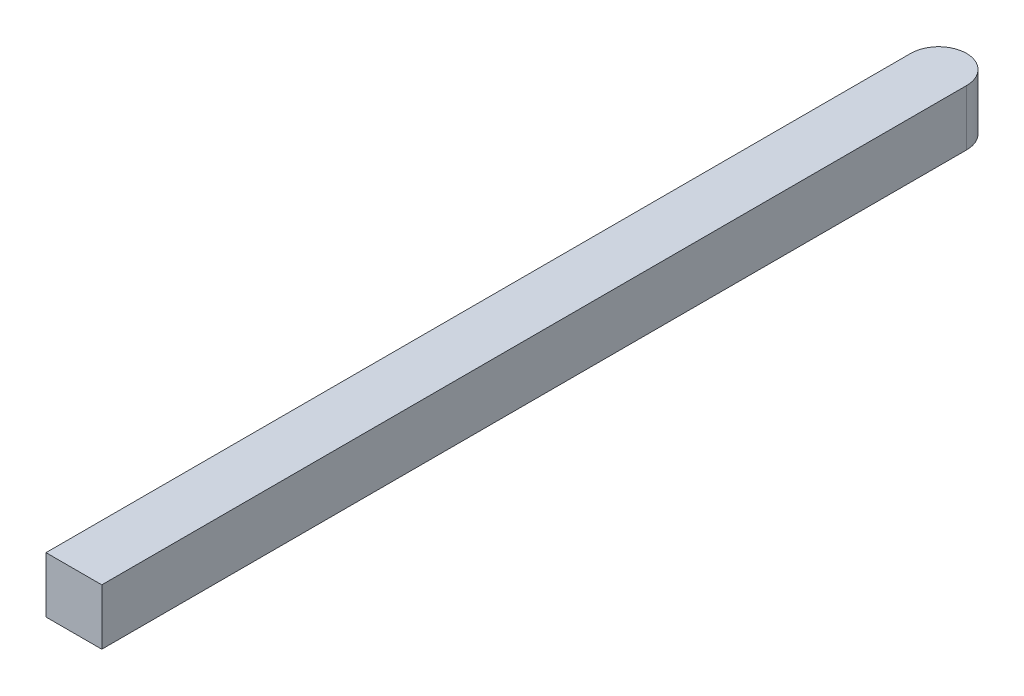
ISO-10303-21;
HEADER;
FILE_DESCRIPTION(('STEP AP214'),'2;1');
FILE_NAME('part.step','',(''),(''),'','','');
FILE_SCHEMA(('AUTOMOTIVE_DESIGN { 1 0 10303 214 1 1 1 1 }'));
ENDSEC;
DATA;
#1=APPLICATION_CONTEXT('core data for automotive mechanical design processes');
#2=APPLICATION_PROTOCOL_DEFINITION('international standard','automotive_design',2000,#1);
#3=PRODUCT_CONTEXT('',#1,'mechanical');
#4=PRODUCT('Part','Part','',(#3));
#5=PRODUCT_RELATED_PRODUCT_CATEGORY('part','',(#4));
#6=PRODUCT_DEFINITION_FORMATION('','',#4);
#7=PRODUCT_DEFINITION_CONTEXT('part definition',#1,'design');
#8=PRODUCT_DEFINITION('design','',#6,#7);
#9=PRODUCT_DEFINITION_SHAPE('','',#8);
#10=(LENGTH_UNIT() NAMED_UNIT(*) SI_UNIT(.MILLI.,.METRE.));
#11=(NAMED_UNIT(*) PLANE_ANGLE_UNIT() SI_UNIT($,.RADIAN.));
#12=(NAMED_UNIT(*) SI_UNIT($,.STERADIAN.) SOLID_ANGLE_UNIT());
#13=UNCERTAINTY_MEASURE_WITH_UNIT(LENGTH_MEASURE(1.E-05),#10,'distance_accuracy_value','');
#14=(GEOMETRIC_REPRESENTATION_CONTEXT(3) GLOBAL_UNCERTAINTY_ASSIGNED_CONTEXT((#13)) GLOBAL_UNIT_ASSIGNED_CONTEXT((#10,
#11,#12)) REPRESENTATION_CONTEXT('',''));
#15=CARTESIAN_POINT('',(0.,0.,0.));
#16=DIRECTION('',(0.,0.,1.));
#17=DIRECTION('',(1.,0.,0.));
#18=AXIS2_PLACEMENT_3D('',#15,#16,#17);
#19=CARTESIAN_POINT('',(0.,50.,0.));
#20=DIRECTION('',(1.,0.,0.));
#21=DIRECTION('',(0.,0.,-1.));
#22=AXIS2_PLACEMENT_3D('',#19,#20,#21);
#23=PLANE('',#22);
#24=DIRECTION('',(0.,0.,1.));
#25=VECTOR('',#24,1.);
#26=CARTESIAN_POINT('',(0.,50.,0.));
#27=LINE('',#26,#25);
#28=CARTESIAN_POINT('',(0.,50.,-775.));
#29=VERTEX_POINT('',#28);
#30=CARTESIAN_POINT('',(0.,50.,0.));
#31=VERTEX_POINT('',#30);
#32=EDGE_CURVE('E86',#29,#31,#27,.T.);
#33=ORIENTED_EDGE('',*,*,#32,.F.);
#34=DIRECTION('',(0.,-1.,0.));
#35=VECTOR('',#34,1.);
#36=CARTESIAN_POINT('',(0.,50.,-775.));
#37=LINE('',#36,#35);
#38=CARTESIAN_POINT('',(0.,0.,-775.));
#39=VERTEX_POINT('',#38);
#40=EDGE_CURVE('E112',#29,#39,#37,.T.);
#41=ORIENTED_EDGE('',*,*,#40,.T.);
#42=DIRECTION('',(0.,0.,1.));
#43=VECTOR('',#42,1.);
#44=CARTESIAN_POINT('',(0.,0.,0.));
#45=LINE('',#44,#43);
#46=CARTESIAN_POINT('',(0.,0.,0.));
#47=VERTEX_POINT('',#46);
#48=EDGE_CURVE('E109',#39,#47,#45,.T.);
#49=ORIENTED_EDGE('',*,*,#48,.T.);
#50=DIRECTION('',(0.,-1.,0.));
#51=VECTOR('',#50,1.);
#52=CARTESIAN_POINT('',(0.,50.,0.));
#53=LINE('',#52,#51);
#54=EDGE_CURVE('E102',#31,#47,#53,.T.);
#55=ORIENTED_EDGE('',*,*,#54,.F.);
#56=EDGE_LOOP('',(#33,#41,#49,#55));
#57=FACE_BOUND('',#56,.T.);
#58=ADVANCED_FACE('F39',(#57),#23,.F.);
#59=CARTESIAN_POINT('',(0.,50.,0.));
#60=DIRECTION('',(0.,0.,-1.));
#61=DIRECTION('',(-1.,0.,0.));
#62=AXIS2_PLACEMENT_3D('',#59,#60,#61);
#63=PLANE('',#62);
#64=DIRECTION('',(1.,0.,0.));
#65=VECTOR('',#64,1.);
#66=CARTESIAN_POINT('',(0.,0.,0.));
#67=LINE('',#66,#65);
#68=CARTESIAN_POINT('',(50.,0.,0.));
#69=VERTEX_POINT('',#68);
#70=EDGE_CURVE('E139',#47,#69,#67,.T.);
#71=ORIENTED_EDGE('',*,*,#70,.T.);
#72=DIRECTION('',(0.,-1.,0.));
#73=VECTOR('',#72,1.);
#74=CARTESIAN_POINT('',(50.,50.,0.));
#75=LINE('',#74,#73);
#76=CARTESIAN_POINT('',(50.,50.,0.));
#77=VERTEX_POINT('',#76);
#78=EDGE_CURVE('E104',#77,#69,#75,.T.);
#79=ORIENTED_EDGE('',*,*,#78,.F.);
#80=DIRECTION('',(1.,0.,0.));
#81=VECTOR('',#80,1.);
#82=CARTESIAN_POINT('',(0.,50.,0.));
#83=LINE('',#82,#81);
#84=EDGE_CURVE('E89',#31,#77,#83,.T.);
#85=ORIENTED_EDGE('',*,*,#84,.F.);
#86=ORIENTED_EDGE('',*,*,#54,.T.);
#87=EDGE_LOOP('',(#71,#79,#85,#86));
#88=FACE_BOUND('',#87,.T.);
#89=ADVANCED_FACE('F101',(#88),#63,.F.);
#90=CARTESIAN_POINT('',(50.,50.,0.));
#91=DIRECTION('',(-1.,0.,0.));
#92=DIRECTION('',(0.,0.,1.));
#93=AXIS2_PLACEMENT_3D('',#90,#91,#92);
#94=PLANE('',#93);
#95=DIRECTION('',(0.,0.,-1.));
#96=VECTOR('',#95,1.);
#97=CARTESIAN_POINT('',(50.,0.,0.));
#98=LINE('',#97,#96);
#99=CARTESIAN_POINT('',(49.9999999999999,0.,-775.));
#100=VERTEX_POINT('',#99);
#101=EDGE_CURVE('E97',#69,#100,#98,.T.);
#102=ORIENTED_EDGE('',*,*,#101,.T.);
#103=DIRECTION('',(0.,-1.,0.));
#104=VECTOR('',#103,1.);
#105=CARTESIAN_POINT('',(49.9999999999999,50.,-775.));
#106=LINE('',#105,#104);
#107=CARTESIAN_POINT('',(49.9999999999999,50.,-775.));
#108=VERTEX_POINT('',#107);
#109=EDGE_CURVE('E11',#100,#108,#106,.F.);
#110=ORIENTED_EDGE('',*,*,#109,.T.);
#111=DIRECTION('',(0.,0.,-1.));
#112=VECTOR('',#111,1.);
#113=CARTESIAN_POINT('',(50.,50.,0.));
#114=LINE('',#113,#112);
#115=EDGE_CURVE('E106',#77,#108,#114,.T.);
#116=ORIENTED_EDGE('',*,*,#115,.F.);
#117=ORIENTED_EDGE('',*,*,#78,.T.);
#118=EDGE_LOOP('',(#102,#110,#116,#117));
#119=FACE_BOUND('',#118,.T.);
#120=ADVANCED_FACE('F145',(#119),#94,.F.);
#121=CARTESIAN_POINT('',(0.,50.,0.));
#122=DIRECTION('',(0.,-1.,0.));
#123=DIRECTION('',(0.,0.,-1.));
#124=AXIS2_PLACEMENT_3D('',#121,#122,#123);
#125=PLANE('',#124);
#126=CARTESIAN_POINT('',(24.9999999999999,50.,-775.));
#127=DIRECTION('',(0.,-1.,0.));
#128=DIRECTION('',(0.,0.,-1.));
#129=AXIS2_PLACEMENT_3D('',#126,#127,#128);
#130=CIRCLE('',#129,25.);
#131=CARTESIAN_POINT('',(24.9999999999999,50.,-800.));
#132=VERTEX_POINT('',#131);
#133=EDGE_CURVE('E56',#108,#132,#130,.F.);
#134=ORIENTED_EDGE('',*,*,#133,.T.);
#135=CARTESIAN_POINT('',(25.,50.,-775.));
#136=DIRECTION('',(0.,-1.,0.));
#137=DIRECTION('',(0.,0.,-1.));
#138=AXIS2_PLACEMENT_3D('',#135,#136,#137);
#139=CIRCLE('',#138,25.);
#140=EDGE_CURVE('E49',#132,#29,#139,.F.);
#141=ORIENTED_EDGE('',*,*,#140,.T.);
#142=ORIENTED_EDGE('',*,*,#32,.T.);
#143=ORIENTED_EDGE('',*,*,#84,.T.);
#144=ORIENTED_EDGE('',*,*,#115,.T.);
#145=EDGE_LOOP('',(#134,#141,#142,#143,#144));
#146=FACE_BOUND('',#145,.T.);
#147=ADVANCED_FACE('F88',(#146),#125,.F.);
#148=CARTESIAN_POINT('',(0.,0.,0.));
#149=DIRECTION('',(0.,-1.,0.));
#150=DIRECTION('',(0.,0.,-1.));
#151=AXIS2_PLACEMENT_3D('',#148,#149,#150);
#152=PLANE('',#151);
#153=ORIENTED_EDGE('',*,*,#48,.F.);
#154=CARTESIAN_POINT('',(25.,0.,-775.));
#155=DIRECTION('',(0.,-1.,0.));
#156=DIRECTION('',(0.,0.,-1.));
#157=AXIS2_PLACEMENT_3D('',#154,#155,#156);
#158=CIRCLE('',#157,25.);
#159=CARTESIAN_POINT('',(24.9999999999999,0.,-800.));
#160=VERTEX_POINT('',#159);
#161=EDGE_CURVE('E123',#39,#160,#158,.T.);
#162=ORIENTED_EDGE('',*,*,#161,.T.);
#163=CARTESIAN_POINT('',(24.9999999999999,0.,-775.));
#164=DIRECTION('',(0.,-1.,0.));
#165=DIRECTION('',(0.,0.,-1.));
#166=AXIS2_PLACEMENT_3D('',#163,#164,#165);
#167=CIRCLE('',#166,25.);
#168=EDGE_CURVE('E116',#160,#100,#167,.T.);
#169=ORIENTED_EDGE('',*,*,#168,.T.);
#170=ORIENTED_EDGE('',*,*,#101,.F.);
#171=ORIENTED_EDGE('',*,*,#70,.F.);
#172=EDGE_LOOP('',(#153,#162,#169,#170,#171));
#173=FACE_BOUND('',#172,.T.);
#174=ADVANCED_FACE('F131',(#173),#152,.T.);
#175=CARTESIAN_POINT('',(24.9999999999999,50.,-775.));
#176=DIRECTION('',(0.,-1.,0.));
#177=DIRECTION('',(0.,0.,-1.));
#178=AXIS2_PLACEMENT_3D('',#175,#176,#177);
#179=CYLINDRICAL_SURFACE('',#178,25.);
#180=DIRECTION('',(0.,-1.,0.));
#181=VECTOR('',#180,1.);
#182=CARTESIAN_POINT('',(24.9999999999999,50.,-800.));
#183=LINE('',#182,#181);
#184=EDGE_CURVE('E43',#132,#160,#183,.T.);
#185=ORIENTED_EDGE('',*,*,#184,.F.);
#186=ORIENTED_EDGE('',*,*,#133,.F.);
#187=ORIENTED_EDGE('',*,*,#109,.F.);
#188=ORIENTED_EDGE('',*,*,#168,.F.);
#189=EDGE_LOOP('',(#185,#186,#187,#188));
#190=FACE_BOUND('',#189,.T.);
#191=ADVANCED_FACE('F41',(#190),#179,.T.);
#192=CARTESIAN_POINT('',(25.,50.,-775.));
#193=DIRECTION('',(0.,-1.,0.));
#194=DIRECTION('',(0.,0.,-1.));
#195=AXIS2_PLACEMENT_3D('',#192,#193,#194);
#196=CYLINDRICAL_SURFACE('',#195,25.);
#197=ORIENTED_EDGE('',*,*,#140,.F.);
#198=ORIENTED_EDGE('',*,*,#184,.T.);
#199=ORIENTED_EDGE('',*,*,#161,.F.);
#200=ORIENTED_EDGE('',*,*,#40,.F.);
#201=EDGE_LOOP('',(#197,#198,#199,#200));
#202=FACE_BOUND('',#201,.T.);
#203=ADVANCED_FACE('F136',(#202),#196,.T.);
#204=CLOSED_SHELL('',(#58,#89,#120,#147,#174,#191,#203));
#205=MANIFOLD_SOLID_BREP('B2',#204);
#206=ADVANCED_BREP_SHAPE_REPRESENTATION('',(#18,#205),#14);
#207=SHAPE_DEFINITION_REPRESENTATION(#9,#206);
ENDSEC;
END-ISO-10303-21;
